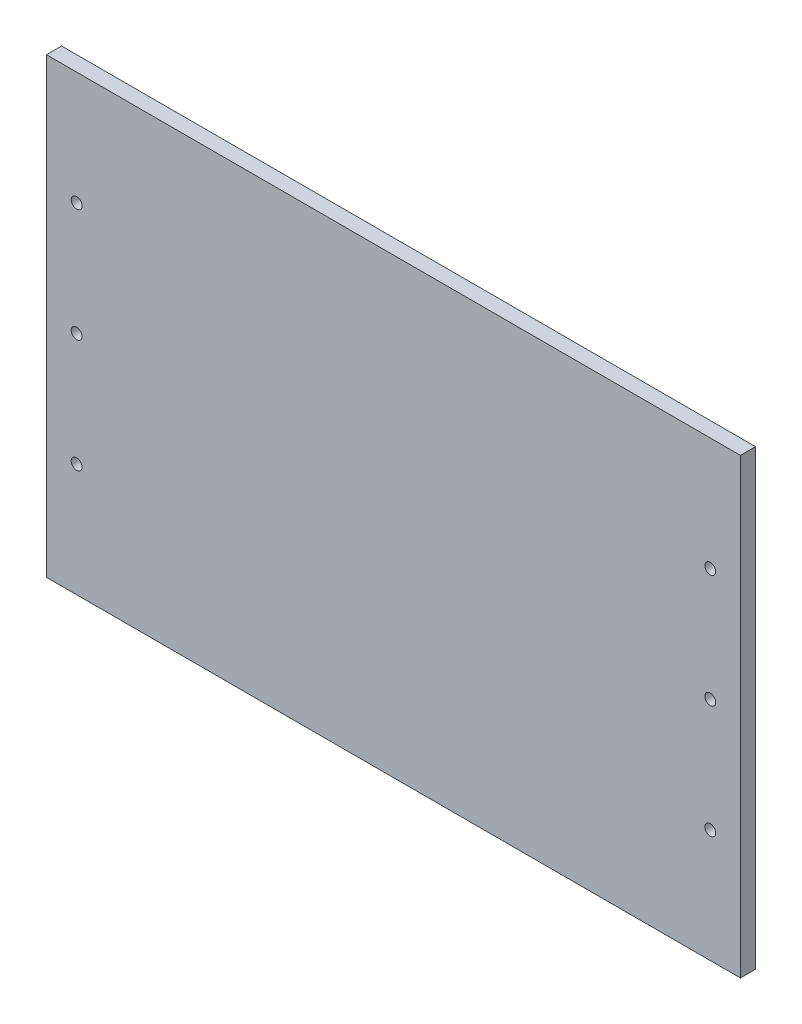
ISO-10303-21;
HEADER;
FILE_DESCRIPTION(('STEP AP214'),'2;1');
FILE_NAME('part.step','',(''),(''),'','','');
FILE_SCHEMA(('AUTOMOTIVE_DESIGN { 1 0 10303 214 1 1 1 1 }'));
ENDSEC;
DATA;
#1=APPLICATION_CONTEXT('core data for automotive mechanical design processes');
#2=APPLICATION_PROTOCOL_DEFINITION('international standard','automotive_design',2000,#1);
#3=PRODUCT_CONTEXT('',#1,'mechanical');
#4=PRODUCT('Part','Part','',(#3));
#5=PRODUCT_RELATED_PRODUCT_CATEGORY('part','',(#4));
#6=PRODUCT_DEFINITION_FORMATION('','',#4);
#7=PRODUCT_DEFINITION_CONTEXT('part definition',#1,'design');
#8=PRODUCT_DEFINITION('design','',#6,#7);
#9=PRODUCT_DEFINITION_SHAPE('','',#8);
#10=(LENGTH_UNIT() NAMED_UNIT(*) SI_UNIT(.MILLI.,.METRE.));
#11=(NAMED_UNIT(*) PLANE_ANGLE_UNIT() SI_UNIT($,.RADIAN.));
#12=(NAMED_UNIT(*) SI_UNIT($,.STERADIAN.) SOLID_ANGLE_UNIT());
#13=UNCERTAINTY_MEASURE_WITH_UNIT(LENGTH_MEASURE(1.E-05),#10,'distance_accuracy_value','');
#14=(GEOMETRIC_REPRESENTATION_CONTEXT(3) GLOBAL_UNCERTAINTY_ASSIGNED_CONTEXT((#13)) GLOBAL_UNIT_ASSIGNED_CONTEXT((#10,
#11,#12)) REPRESENTATION_CONTEXT('',''));
#15=CARTESIAN_POINT('',(0.,0.,0.));
#16=DIRECTION('',(0.,0.,1.));
#17=DIRECTION('',(1.,0.,0.));
#18=AXIS2_PLACEMENT_3D('',#15,#16,#17);
#19=CARTESIAN_POINT('',(115.,-75.,5.));
#20=DIRECTION('',(-1.,0.,0.));
#21=DIRECTION('',(0.,0.,1.));
#22=AXIS2_PLACEMENT_3D('',#19,#20,#21);
#23=PLANE('',#22);
#24=DIRECTION('',(0.,1.,0.));
#25=VECTOR('',#24,1.);
#26=CARTESIAN_POINT('',(115.,-75.,0.));
#27=LINE('',#26,#25);
#28=CARTESIAN_POINT('',(115.,-75.,0.));
#29=VERTEX_POINT('',#28);
#30=CARTESIAN_POINT('',(115.,75.,0.));
#31=VERTEX_POINT('',#30);
#32=EDGE_CURVE('E107',#29,#31,#27,.T.);
#33=ORIENTED_EDGE('',*,*,#32,.T.);
#34=DIRECTION('',(0.,0.,-1.));
#35=VECTOR('',#34,1.);
#36=CARTESIAN_POINT('',(115.,75.,5.));
#37=LINE('',#36,#35);
#38=CARTESIAN_POINT('',(115.,75.,5.));
#39=VERTEX_POINT('',#38);
#40=EDGE_CURVE('E11',#39,#31,#37,.T.);
#41=ORIENTED_EDGE('',*,*,#40,.F.);
#42=DIRECTION('',(0.,1.,0.));
#43=VECTOR('',#42,1.);
#44=CARTESIAN_POINT('',(115.,-75.,5.));
#45=LINE('',#44,#43);
#46=CARTESIAN_POINT('',(115.,-75.,5.));
#47=VERTEX_POINT('',#46);
#48=EDGE_CURVE('E94',#47,#39,#45,.T.);
#49=ORIENTED_EDGE('',*,*,#48,.F.);
#50=DIRECTION('',(0.,0.,-1.));
#51=VECTOR('',#50,1.);
#52=CARTESIAN_POINT('',(115.,-75.,5.));
#53=LINE('',#52,#51);
#54=EDGE_CURVE('E103',#47,#29,#53,.T.);
#55=ORIENTED_EDGE('',*,*,#54,.T.);
#56=EDGE_LOOP('',(#33,#41,#49,#55));
#57=FACE_BOUND('',#56,.T.);
#58=ADVANCED_FACE('F41',(#57),#23,.F.);
#59=CARTESIAN_POINT('',(-115.,74.9999999999999,5.));
#60=DIRECTION('',(0.,-1.,0.));
#61=DIRECTION('',(1.,0.,0.));
#62=AXIS2_PLACEMENT_3D('',#59,#60,#61);
#63=PLANE('',#62);
#64=DIRECTION('',(-1.,0.,0.));
#65=VECTOR('',#64,1.);
#66=CARTESIAN_POINT('',(-115.,74.9999999999999,0.));
#67=LINE('',#66,#65);
#68=CARTESIAN_POINT('',(-115.,74.9999999999999,0.));
#69=VERTEX_POINT('',#68);
#70=EDGE_CURVE('E98',#31,#69,#67,.T.);
#71=ORIENTED_EDGE('',*,*,#70,.T.);
#72=DIRECTION('',(0.,0.,-1.));
#73=VECTOR('',#72,1.);
#74=CARTESIAN_POINT('',(-115.,74.9999999999999,5.));
#75=LINE('',#74,#73);
#76=CARTESIAN_POINT('',(-115.,74.9999999999999,5.));
#77=VERTEX_POINT('',#76);
#78=EDGE_CURVE('E50',#77,#69,#75,.T.);
#79=ORIENTED_EDGE('',*,*,#78,.F.);
#80=DIRECTION('',(-1.,0.,0.));
#81=VECTOR('',#80,1.);
#82=CARTESIAN_POINT('',(-115.,74.9999999999999,5.));
#83=LINE('',#82,#81);
#84=EDGE_CURVE('E89',#39,#77,#83,.T.);
#85=ORIENTED_EDGE('',*,*,#84,.F.);
#86=ORIENTED_EDGE('',*,*,#40,.T.);
#87=EDGE_LOOP('',(#71,#79,#85,#86));
#88=FACE_BOUND('',#87,.T.);
#89=ADVANCED_FACE('F97',(#88),#63,.F.);
#90=CARTESIAN_POINT('',(-115.,-75.,5.));
#91=DIRECTION('',(1.,0.,0.));
#92=DIRECTION('',(0.,1.,0.));
#93=AXIS2_PLACEMENT_3D('',#90,#91,#92);
#94=PLANE('',#93);
#95=DIRECTION('',(0.,-1.,0.));
#96=VECTOR('',#95,1.);
#97=CARTESIAN_POINT('',(-115.,-75.,0.));
#98=LINE('',#97,#96);
#99=CARTESIAN_POINT('',(-115.,-75.,0.));
#100=VERTEX_POINT('',#99);
#101=EDGE_CURVE('E76',#69,#100,#98,.T.);
#102=ORIENTED_EDGE('',*,*,#101,.T.);
#103=DIRECTION('',(0.,0.,-1.));
#104=VECTOR('',#103,1.);
#105=CARTESIAN_POINT('',(-115.,-75.,5.));
#106=LINE('',#105,#104);
#107=CARTESIAN_POINT('',(-115.,-75.,5.));
#108=VERTEX_POINT('',#107);
#109=EDGE_CURVE('E99',#108,#100,#106,.T.);
#110=ORIENTED_EDGE('',*,*,#109,.F.);
#111=DIRECTION('',(0.,-1.,0.));
#112=VECTOR('',#111,1.);
#113=CARTESIAN_POINT('',(-115.,-75.,5.));
#114=LINE('',#113,#112);
#115=EDGE_CURVE('E92',#77,#108,#114,.T.);
#116=ORIENTED_EDGE('',*,*,#115,.F.);
#117=ORIENTED_EDGE('',*,*,#78,.T.);
#118=EDGE_LOOP('',(#102,#110,#116,#117));
#119=FACE_BOUND('',#118,.T.);
#120=ADVANCED_FACE('F101',(#119),#94,.F.);
#121=CARTESIAN_POINT('',(-115.,-75.,5.));
#122=DIRECTION('',(0.,1.,0.));
#123=DIRECTION('',(-1.,0.,0.));
#124=AXIS2_PLACEMENT_3D('',#121,#122,#123);
#125=PLANE('',#124);
#126=DIRECTION('',(1.,0.,0.));
#127=VECTOR('',#126,1.);
#128=CARTESIAN_POINT('',(-115.,-75.,0.));
#129=LINE('',#128,#127);
#130=EDGE_CURVE('E82',#100,#29,#129,.T.);
#131=ORIENTED_EDGE('',*,*,#130,.T.);
#132=ORIENTED_EDGE('',*,*,#54,.F.);
#133=DIRECTION('',(1.,0.,0.));
#134=VECTOR('',#133,1.);
#135=CARTESIAN_POINT('',(-115.,-75.,5.));
#136=LINE('',#135,#134);
#137=EDGE_CURVE('E59',#108,#47,#136,.T.);
#138=ORIENTED_EDGE('',*,*,#137,.F.);
#139=ORIENTED_EDGE('',*,*,#109,.T.);
#140=EDGE_LOOP('',(#131,#132,#138,#139));
#141=FACE_BOUND('',#140,.T.);
#142=ADVANCED_FACE('F201',(#141),#125,.F.);
#143=CARTESIAN_POINT('',(0.,0.,5.));
#144=DIRECTION('',(0.,0.,-1.));
#145=DIRECTION('',(-1.,0.,0.));
#146=AXIS2_PLACEMENT_3D('',#143,#144,#145);
#147=PLANE('',#146);
#148=CARTESIAN_POINT('',(-105.,37.5,5.));
#149=DIRECTION('',(0.,0.,-1.));
#150=DIRECTION('',(-1.,0.,0.));
#151=AXIS2_PLACEMENT_3D('',#148,#149,#150);
#152=CIRCLE('',#151,1.8);
#153=CARTESIAN_POINT('',(-106.8,37.5,5.));
#154=VERTEX_POINT('',#153);
#155=EDGE_CURVE('E44',#154,#154,#152,.T.);
#156=ORIENTED_EDGE('',*,*,#155,.T.);
#157=EDGE_LOOP('',(#156));
#158=FACE_BOUND('',#157,.T.);
#159=CARTESIAN_POINT('',(-105.,0.,5.));
#160=DIRECTION('',(0.,0.,-1.));
#161=DIRECTION('',(-1.,0.,0.));
#162=AXIS2_PLACEMENT_3D('',#159,#160,#161);
#163=CIRCLE('',#162,1.8);
#164=CARTESIAN_POINT('',(-106.8,0.,5.));
#165=VERTEX_POINT('',#164);
#166=EDGE_CURVE('E133',#165,#165,#163,.T.);
#167=ORIENTED_EDGE('',*,*,#166,.T.);
#168=EDGE_LOOP('',(#167));
#169=FACE_BOUND('',#168,.T.);
#170=CARTESIAN_POINT('',(-105.,-37.5,5.));
#171=DIRECTION('',(0.,0.,-1.));
#172=DIRECTION('',(-1.,0.,0.));
#173=AXIS2_PLACEMENT_3D('',#170,#171,#172);
#174=CIRCLE('',#173,1.8);
#175=CARTESIAN_POINT('',(-106.8,-37.5,5.));
#176=VERTEX_POINT('',#175);
#177=EDGE_CURVE('E129',#176,#176,#174,.T.);
#178=ORIENTED_EDGE('',*,*,#177,.T.);
#179=EDGE_LOOP('',(#178));
#180=FACE_BOUND('',#179,.T.);
#181=CARTESIAN_POINT('',(105.,-37.5,5.));
#182=DIRECTION('',(0.,0.,-1.));
#183=DIRECTION('',(-1.,0.,0.));
#184=AXIS2_PLACEMENT_3D('',#181,#182,#183);
#185=CIRCLE('',#184,1.8);
#186=CARTESIAN_POINT('',(103.2,-37.5,5.));
#187=VERTEX_POINT('',#186);
#188=EDGE_CURVE('E124',#187,#187,#185,.T.);
#189=ORIENTED_EDGE('',*,*,#188,.T.);
#190=EDGE_LOOP('',(#189));
#191=FACE_BOUND('',#190,.T.);
#192=CARTESIAN_POINT('',(105.,0.,5.));
#193=DIRECTION('',(0.,0.,-1.));
#194=DIRECTION('',(-1.,0.,0.));
#195=AXIS2_PLACEMENT_3D('',#192,#193,#194);
#196=CIRCLE('',#195,1.8);
#197=CARTESIAN_POINT('',(103.2,0.,5.));
#198=VERTEX_POINT('',#197);
#199=EDGE_CURVE('E119',#198,#198,#196,.T.);
#200=ORIENTED_EDGE('',*,*,#199,.T.);
#201=EDGE_LOOP('',(#200));
#202=FACE_BOUND('',#201,.T.);
#203=CARTESIAN_POINT('',(105.,37.5,5.));
#204=DIRECTION('',(0.,0.,-1.));
#205=DIRECTION('',(-1.,0.,0.));
#206=AXIS2_PLACEMENT_3D('',#203,#204,#205);
#207=CIRCLE('',#206,1.8);
#208=CARTESIAN_POINT('',(103.2,37.5,5.));
#209=VERTEX_POINT('',#208);
#210=EDGE_CURVE('E110',#209,#209,#207,.T.);
#211=ORIENTED_EDGE('',*,*,#210,.T.);
#212=EDGE_LOOP('',(#211));
#213=FACE_BOUND('',#212,.T.);
#214=ORIENTED_EDGE('',*,*,#48,.T.);
#215=ORIENTED_EDGE('',*,*,#84,.T.);
#216=ORIENTED_EDGE('',*,*,#115,.T.);
#217=ORIENTED_EDGE('',*,*,#137,.T.);
#218=EDGE_LOOP('',(#214,#215,#216,#217));
#219=FACE_BOUND('',#218,.T.);
#220=ADVANCED_FACE('F90',(#158,#169,#180,#191,#202,#213,#219),#147,.F.);
#221=CARTESIAN_POINT('',(0.,0.,0.));
#222=DIRECTION('',(0.,0.,-1.));
#223=DIRECTION('',(-1.,0.,0.));
#224=AXIS2_PLACEMENT_3D('',#221,#222,#223);
#225=PLANE('',#224);
#226=CARTESIAN_POINT('',(-105.,37.5,0.));
#227=DIRECTION('',(0.,0.,-1.));
#228=DIRECTION('',(-1.,0.,0.));
#229=AXIS2_PLACEMENT_3D('',#226,#227,#228);
#230=CIRCLE('',#229,3.5);
#231=CARTESIAN_POINT('',(-108.5,37.5,0.));
#232=VERTEX_POINT('',#231);
#233=EDGE_CURVE('E416',#232,#232,#230,.T.);
#234=ORIENTED_EDGE('',*,*,#233,.F.);
#235=EDGE_LOOP('',(#234));
#236=FACE_BOUND('',#235,.T.);
#237=CARTESIAN_POINT('',(-105.,0.,0.));
#238=DIRECTION('',(0.,0.,-1.));
#239=DIRECTION('',(-1.,0.,0.));
#240=AXIS2_PLACEMENT_3D('',#237,#238,#239);
#241=CIRCLE('',#240,3.5);
#242=CARTESIAN_POINT('',(-108.5,0.,0.));
#243=VERTEX_POINT('',#242);
#244=EDGE_CURVE('E148',#243,#243,#241,.T.);
#245=ORIENTED_EDGE('',*,*,#244,.F.);
#246=EDGE_LOOP('',(#245));
#247=FACE_BOUND('',#246,.T.);
#248=CARTESIAN_POINT('',(-105.,-37.5,0.));
#249=DIRECTION('',(0.,0.,-1.));
#250=DIRECTION('',(-1.,0.,0.));
#251=AXIS2_PLACEMENT_3D('',#248,#249,#250);
#252=CIRCLE('',#251,3.5);
#253=CARTESIAN_POINT('',(-108.5,-37.5,0.));
#254=VERTEX_POINT('',#253);
#255=EDGE_CURVE('E135',#254,#254,#252,.T.);
#256=ORIENTED_EDGE('',*,*,#255,.F.);
#257=EDGE_LOOP('',(#256));
#258=FACE_BOUND('',#257,.T.);
#259=CARTESIAN_POINT('',(105.,-37.5,0.));
#260=DIRECTION('',(0.,0.,-1.));
#261=DIRECTION('',(-1.,0.,0.));
#262=AXIS2_PLACEMENT_3D('',#259,#260,#261);
#263=CIRCLE('',#262,3.5);
#264=CARTESIAN_POINT('',(101.5,-37.5,0.));
#265=VERTEX_POINT('',#264);
#266=EDGE_CURVE('E131',#265,#265,#263,.T.);
#267=ORIENTED_EDGE('',*,*,#266,.F.);
#268=EDGE_LOOP('',(#267));
#269=FACE_BOUND('',#268,.T.);
#270=CARTESIAN_POINT('',(105.,0.,0.));
#271=DIRECTION('',(0.,0.,-1.));
#272=DIRECTION('',(-1.,0.,0.));
#273=AXIS2_PLACEMENT_3D('',#270,#271,#272);
#274=CIRCLE('',#273,3.5);
#275=CARTESIAN_POINT('',(101.5,0.,0.));
#276=VERTEX_POINT('',#275);
#277=EDGE_CURVE('E127',#276,#276,#274,.T.);
#278=ORIENTED_EDGE('',*,*,#277,.F.);
#279=EDGE_LOOP('',(#278));
#280=FACE_BOUND('',#279,.T.);
#281=CARTESIAN_POINT('',(105.,37.5,0.));
#282=DIRECTION('',(0.,0.,-1.));
#283=DIRECTION('',(-1.,0.,0.));
#284=AXIS2_PLACEMENT_3D('',#281,#282,#283);
#285=CIRCLE('',#284,3.5);
#286=CARTESIAN_POINT('',(101.5,37.5,0.));
#287=VERTEX_POINT('',#286);
#288=EDGE_CURVE('E122',#287,#287,#285,.T.);
#289=ORIENTED_EDGE('',*,*,#288,.F.);
#290=EDGE_LOOP('',(#289));
#291=FACE_BOUND('',#290,.T.);
#292=ORIENTED_EDGE('',*,*,#32,.F.);
#293=ORIENTED_EDGE('',*,*,#130,.F.);
#294=ORIENTED_EDGE('',*,*,#101,.F.);
#295=ORIENTED_EDGE('',*,*,#70,.F.);
#296=EDGE_LOOP('',(#292,#293,#294,#295));
#297=FACE_BOUND('',#296,.T.);
#298=ADVANCED_FACE('F194',(#236,#247,#258,#269,#280,#291,#297),#225,.T.);
#299=CARTESIAN_POINT('',(105.,37.5,0.));
#300=DIRECTION('',(0.,0.,-1.));
#301=DIRECTION('',(-1.,0.,0.));
#302=AXIS2_PLACEMENT_3D('',#299,#300,#301);
#303=CYLINDRICAL_SURFACE('',#302,1.8);
#304=CARTESIAN_POINT('',(105.,37.5,2.4));
#305=DIRECTION('',(0.,0.,-1.));
#306=DIRECTION('',(-1.,0.,0.));
#307=AXIS2_PLACEMENT_3D('',#304,#305,#306);
#308=CIRCLE('',#307,1.8);
#309=CARTESIAN_POINT('',(103.2,37.5,2.4));
#310=VERTEX_POINT('',#309);
#311=EDGE_CURVE('E118',#310,#310,#308,.T.);
#312=ORIENTED_EDGE('',*,*,#311,.T.);
#313=EDGE_LOOP('',(#312));
#314=FACE_BOUND('',#313,.T.);
#315=ORIENTED_EDGE('',*,*,#210,.F.);
#316=EDGE_LOOP('',(#315));
#317=FACE_BOUND('',#316,.T.);
#318=ADVANCED_FACE('F178',(#314,#317),#303,.F.);
#319=CARTESIAN_POINT('',(106.8,37.5,2.4));
#320=DIRECTION('',(0.,0.,1.));
#321=DIRECTION('',(1.,0.,0.));
#322=AXIS2_PLACEMENT_3D('',#319,#320,#321);
#323=PLANE('',#322);
#324=ORIENTED_EDGE('',*,*,#311,.F.);
#325=EDGE_LOOP('',(#324));
#326=FACE_BOUND('',#325,.T.);
#327=CARTESIAN_POINT('',(105.,37.5,2.4));
#328=DIRECTION('',(0.,0.,-1.));
#329=DIRECTION('',(-1.,0.,0.));
#330=AXIS2_PLACEMENT_3D('',#327,#328,#329);
#331=CIRCLE('',#330,3.5);
#332=CARTESIAN_POINT('',(101.5,37.5,2.4));
#333=VERTEX_POINT('',#332);
#334=EDGE_CURVE('E172',#333,#333,#331,.T.);
#335=ORIENTED_EDGE('',*,*,#334,.T.);
#336=EDGE_LOOP('',(#335));
#337=FACE_BOUND('',#336,.T.);
#338=ADVANCED_FACE('F181',(#326,#337),#323,.F.);
#339=CARTESIAN_POINT('',(105.,37.5,0.));
#340=DIRECTION('',(0.,0.,-1.));
#341=DIRECTION('',(-1.,0.,0.));
#342=AXIS2_PLACEMENT_3D('',#339,#340,#341);
#343=CYLINDRICAL_SURFACE('',#342,3.5);
#344=ORIENTED_EDGE('',*,*,#334,.F.);
#345=EDGE_LOOP('',(#344));
#346=FACE_BOUND('',#345,.T.);
#347=ORIENTED_EDGE('',*,*,#288,.T.);
#348=EDGE_LOOP('',(#347));
#349=FACE_BOUND('',#348,.T.);
#350=ADVANCED_FACE('F184',(#346,#349),#343,.F.);
#351=CARTESIAN_POINT('',(105.,0.,0.));
#352=DIRECTION('',(0.,0.,-1.));
#353=DIRECTION('',(-1.,0.,0.));
#354=AXIS2_PLACEMENT_3D('',#351,#352,#353);
#355=CYLINDRICAL_SURFACE('',#354,1.8);
#356=CARTESIAN_POINT('',(105.,0.,2.4));
#357=DIRECTION('',(0.,0.,-1.));
#358=DIRECTION('',(-1.,0.,0.));
#359=AXIS2_PLACEMENT_3D('',#356,#357,#358);
#360=CIRCLE('',#359,1.8);
#361=CARTESIAN_POINT('',(103.2,0.,2.4));
#362=VERTEX_POINT('',#361);
#363=EDGE_CURVE('E123',#362,#362,#360,.T.);
#364=ORIENTED_EDGE('',*,*,#363,.T.);
#365=EDGE_LOOP('',(#364));
#366=FACE_BOUND('',#365,.T.);
#367=ORIENTED_EDGE('',*,*,#199,.F.);
#368=EDGE_LOOP('',(#367));
#369=FACE_BOUND('',#368,.T.);
#370=ADVANCED_FACE('F190',(#366,#369),#355,.F.);
#371=CARTESIAN_POINT('',(106.8,0.,2.4));
#372=DIRECTION('',(0.,0.,1.));
#373=DIRECTION('',(1.,0.,0.));
#374=AXIS2_PLACEMENT_3D('',#371,#372,#373);
#375=PLANE('',#374);
#376=ORIENTED_EDGE('',*,*,#363,.F.);
#377=EDGE_LOOP('',(#376));
#378=FACE_BOUND('',#377,.T.);
#379=CARTESIAN_POINT('',(105.,0.,2.4));
#380=DIRECTION('',(0.,0.,-1.));
#381=DIRECTION('',(-1.,0.,0.));
#382=AXIS2_PLACEMENT_3D('',#379,#380,#381);
#383=CIRCLE('',#382,3.5);
#384=CARTESIAN_POINT('',(101.5,0.,2.4));
#385=VERTEX_POINT('',#384);
#386=EDGE_CURVE('E165',#385,#385,#383,.T.);
#387=ORIENTED_EDGE('',*,*,#386,.T.);
#388=EDGE_LOOP('',(#387));
#389=FACE_BOUND('',#388,.T.);
#390=ADVANCED_FACE('F268',(#378,#389),#375,.F.);
#391=CARTESIAN_POINT('',(105.,0.,0.));
#392=DIRECTION('',(0.,0.,-1.));
#393=DIRECTION('',(-1.,0.,0.));
#394=AXIS2_PLACEMENT_3D('',#391,#392,#393);
#395=CYLINDRICAL_SURFACE('',#394,3.5);
#396=ORIENTED_EDGE('',*,*,#386,.F.);
#397=EDGE_LOOP('',(#396));
#398=FACE_BOUND('',#397,.T.);
#399=ORIENTED_EDGE('',*,*,#277,.T.);
#400=EDGE_LOOP('',(#399));
#401=FACE_BOUND('',#400,.T.);
#402=ADVANCED_FACE('F278',(#398,#401),#395,.F.);
#403=CARTESIAN_POINT('',(105.,-37.5,0.));
#404=DIRECTION('',(0.,0.,-1.));
#405=DIRECTION('',(-1.,0.,0.));
#406=AXIS2_PLACEMENT_3D('',#403,#404,#405);
#407=CYLINDRICAL_SURFACE('',#406,1.8);
#408=CARTESIAN_POINT('',(105.,-37.5,2.4));
#409=DIRECTION('',(0.,0.,-1.));
#410=DIRECTION('',(-1.,0.,0.));
#411=AXIS2_PLACEMENT_3D('',#408,#409,#410);
#412=CIRCLE('',#411,1.8);
#413=CARTESIAN_POINT('',(103.2,-37.5,2.4));
#414=VERTEX_POINT('',#413);
#415=EDGE_CURVE('E128',#414,#414,#412,.T.);
#416=ORIENTED_EDGE('',*,*,#415,.T.);
#417=EDGE_LOOP('',(#416));
#418=FACE_BOUND('',#417,.T.);
#419=ORIENTED_EDGE('',*,*,#188,.F.);
#420=EDGE_LOOP('',(#419));
#421=FACE_BOUND('',#420,.T.);
#422=ADVANCED_FACE('F288',(#418,#421),#407,.F.);
#423=CARTESIAN_POINT('',(106.8,-37.5,2.4));
#424=DIRECTION('',(0.,0.,1.));
#425=DIRECTION('',(1.,0.,0.));
#426=AXIS2_PLACEMENT_3D('',#423,#424,#425);
#427=PLANE('',#426);
#428=ORIENTED_EDGE('',*,*,#415,.F.);
#429=EDGE_LOOP('',(#428));
#430=FACE_BOUND('',#429,.T.);
#431=CARTESIAN_POINT('',(105.,-37.5,2.4));
#432=DIRECTION('',(0.,0.,-1.));
#433=DIRECTION('',(-1.,0.,0.));
#434=AXIS2_PLACEMENT_3D('',#431,#432,#433);
#435=CIRCLE('',#434,3.5);
#436=CARTESIAN_POINT('',(101.5,-37.5,2.4));
#437=VERTEX_POINT('',#436);
#438=EDGE_CURVE('E158',#437,#437,#435,.T.);
#439=ORIENTED_EDGE('',*,*,#438,.T.);
#440=EDGE_LOOP('',(#439));
#441=FACE_BOUND('',#440,.T.);
#442=ADVANCED_FACE('F298',(#430,#441),#427,.F.);
#443=CARTESIAN_POINT('',(105.,-37.5,0.));
#444=DIRECTION('',(0.,0.,-1.));
#445=DIRECTION('',(-1.,0.,0.));
#446=AXIS2_PLACEMENT_3D('',#443,#444,#445);
#447=CYLINDRICAL_SURFACE('',#446,3.5);
#448=ORIENTED_EDGE('',*,*,#438,.F.);
#449=EDGE_LOOP('',(#448));
#450=FACE_BOUND('',#449,.T.);
#451=ORIENTED_EDGE('',*,*,#266,.T.);
#452=EDGE_LOOP('',(#451));
#453=FACE_BOUND('',#452,.T.);
#454=ADVANCED_FACE('F308',(#450,#453),#447,.F.);
#455=CARTESIAN_POINT('',(-105.,-37.5,0.));
#456=DIRECTION('',(0.,0.,-1.));
#457=DIRECTION('',(-1.,0.,0.));
#458=AXIS2_PLACEMENT_3D('',#455,#456,#457);
#459=CYLINDRICAL_SURFACE('',#458,1.8);
#460=CARTESIAN_POINT('',(-105.,-37.5,2.4));
#461=DIRECTION('',(0.,0.,-1.));
#462=DIRECTION('',(-1.,0.,0.));
#463=AXIS2_PLACEMENT_3D('',#460,#461,#462);
#464=CIRCLE('',#463,1.8);
#465=CARTESIAN_POINT('',(-106.8,-37.5,2.4));
#466=VERTEX_POINT('',#465);
#467=EDGE_CURVE('E132',#466,#466,#464,.T.);
#468=ORIENTED_EDGE('',*,*,#467,.T.);
#469=EDGE_LOOP('',(#468));
#470=FACE_BOUND('',#469,.T.);
#471=ORIENTED_EDGE('',*,*,#177,.F.);
#472=EDGE_LOOP('',(#471));
#473=FACE_BOUND('',#472,.T.);
#474=ADVANCED_FACE('F318',(#470,#473),#459,.F.);
#475=CARTESIAN_POINT('',(-103.2,-37.5,2.4));
#476=DIRECTION('',(0.,0.,1.));
#477=DIRECTION('',(1.,0.,0.));
#478=AXIS2_PLACEMENT_3D('',#475,#476,#477);
#479=PLANE('',#478);
#480=ORIENTED_EDGE('',*,*,#467,.F.);
#481=EDGE_LOOP('',(#480));
#482=FACE_BOUND('',#481,.T.);
#483=CARTESIAN_POINT('',(-105.,-37.5,2.4));
#484=DIRECTION('',(0.,0.,-1.));
#485=DIRECTION('',(-1.,0.,0.));
#486=AXIS2_PLACEMENT_3D('',#483,#484,#485);
#487=CIRCLE('',#486,3.5);
#488=CARTESIAN_POINT('',(-108.5,-37.5,2.4));
#489=VERTEX_POINT('',#488);
#490=EDGE_CURVE('E140',#489,#489,#487,.T.);
#491=ORIENTED_EDGE('',*,*,#490,.T.);
#492=EDGE_LOOP('',(#491));
#493=FACE_BOUND('',#492,.T.);
#494=ADVANCED_FACE('F328',(#482,#493),#479,.F.);
#495=CARTESIAN_POINT('',(-105.,-37.5,0.));
#496=DIRECTION('',(0.,0.,-1.));
#497=DIRECTION('',(-1.,0.,0.));
#498=AXIS2_PLACEMENT_3D('',#495,#496,#497);
#499=CYLINDRICAL_SURFACE('',#498,3.5);
#500=ORIENTED_EDGE('',*,*,#490,.F.);
#501=EDGE_LOOP('',(#500));
#502=FACE_BOUND('',#501,.T.);
#503=ORIENTED_EDGE('',*,*,#255,.T.);
#504=EDGE_LOOP('',(#503));
#505=FACE_BOUND('',#504,.T.);
#506=ADVANCED_FACE('F338',(#502,#505),#499,.F.);
#507=CARTESIAN_POINT('',(-105.,0.,0.));
#508=DIRECTION('',(0.,0.,-1.));
#509=DIRECTION('',(-1.,0.,0.));
#510=AXIS2_PLACEMENT_3D('',#507,#508,#509);
#511=CYLINDRICAL_SURFACE('',#510,1.8);
#512=CARTESIAN_POINT('',(-105.,0.,2.4));
#513=DIRECTION('',(0.,0.,-1.));
#514=DIRECTION('',(-1.,0.,0.));
#515=AXIS2_PLACEMENT_3D('',#512,#513,#514);
#516=CIRCLE('',#515,1.8);
#517=CARTESIAN_POINT('',(-106.8,0.,2.4));
#518=VERTEX_POINT('',#517);
#519=EDGE_CURVE('E136',#518,#518,#516,.T.);
#520=ORIENTED_EDGE('',*,*,#519,.T.);
#521=EDGE_LOOP('',(#520));
#522=FACE_BOUND('',#521,.T.);
#523=ORIENTED_EDGE('',*,*,#166,.F.);
#524=EDGE_LOOP('',(#523));
#525=FACE_BOUND('',#524,.T.);
#526=ADVANCED_FACE('F348',(#522,#525),#511,.F.);
#527=CARTESIAN_POINT('',(-103.2,0.,2.4));
#528=DIRECTION('',(0.,0.,1.));
#529=DIRECTION('',(1.,0.,0.));
#530=AXIS2_PLACEMENT_3D('',#527,#528,#529);
#531=PLANE('',#530);
#532=ORIENTED_EDGE('',*,*,#519,.F.);
#533=EDGE_LOOP('',(#532));
#534=FACE_BOUND('',#533,.T.);
#535=CARTESIAN_POINT('',(-105.,0.,2.4));
#536=DIRECTION('',(0.,0.,-1.));
#537=DIRECTION('',(-1.,0.,0.));
#538=AXIS2_PLACEMENT_3D('',#535,#536,#537);
#539=CIRCLE('',#538,3.5);
#540=CARTESIAN_POINT('',(-108.5,0.,2.4));
#541=VERTEX_POINT('',#540);
#542=EDGE_CURVE('E143',#541,#541,#539,.T.);
#543=ORIENTED_EDGE('',*,*,#542,.T.);
#544=EDGE_LOOP('',(#543));
#545=FACE_BOUND('',#544,.T.);
#546=ADVANCED_FACE('F358',(#534,#545),#531,.F.);
#547=CARTESIAN_POINT('',(-105.,0.,0.));
#548=DIRECTION('',(0.,0.,-1.));
#549=DIRECTION('',(-1.,0.,0.));
#550=AXIS2_PLACEMENT_3D('',#547,#548,#549);
#551=CYLINDRICAL_SURFACE('',#550,3.5);
#552=ORIENTED_EDGE('',*,*,#542,.F.);
#553=EDGE_LOOP('',(#552));
#554=FACE_BOUND('',#553,.T.);
#555=ORIENTED_EDGE('',*,*,#244,.T.);
#556=EDGE_LOOP('',(#555));
#557=FACE_BOUND('',#556,.T.);
#558=ADVANCED_FACE('F367',(#554,#557),#551,.F.);
#559=CARTESIAN_POINT('',(-105.,37.5,0.));
#560=DIRECTION('',(0.,0.,-1.));
#561=DIRECTION('',(-1.,0.,0.));
#562=AXIS2_PLACEMENT_3D('',#559,#560,#561);
#563=CYLINDRICAL_SURFACE('',#562,1.8);
#564=CARTESIAN_POINT('',(-105.,37.5,2.4));
#565=DIRECTION('',(0.,0.,-1.));
#566=DIRECTION('',(-1.,0.,0.));
#567=AXIS2_PLACEMENT_3D('',#564,#565,#566);
#568=CIRCLE('',#567,1.8);
#569=CARTESIAN_POINT('',(-106.8,37.5,2.4));
#570=VERTEX_POINT('',#569);
#571=EDGE_CURVE('E418',#570,#570,#568,.T.);
#572=ORIENTED_EDGE('',*,*,#571,.T.);
#573=EDGE_LOOP('',(#572));
#574=FACE_BOUND('',#573,.T.);
#575=ORIENTED_EDGE('',*,*,#155,.F.);
#576=EDGE_LOOP('',(#575));
#577=FACE_BOUND('',#576,.T.);
#578=ADVANCED_FACE('F377',(#574,#577),#563,.F.);
#579=CARTESIAN_POINT('',(-103.2,37.5,2.4));
#580=DIRECTION('',(0.,0.,1.));
#581=DIRECTION('',(1.,0.,0.));
#582=AXIS2_PLACEMENT_3D('',#579,#580,#581);
#583=PLANE('',#582);
#584=ORIENTED_EDGE('',*,*,#571,.F.);
#585=EDGE_LOOP('',(#584));
#586=FACE_BOUND('',#585,.T.);
#587=CARTESIAN_POINT('',(-105.,37.5,2.4));
#588=DIRECTION('',(0.,0.,-1.));
#589=DIRECTION('',(-1.,0.,0.));
#590=AXIS2_PLACEMENT_3D('',#587,#588,#589);
#591=CIRCLE('',#590,3.5);
#592=CARTESIAN_POINT('',(-108.5,37.5,2.4));
#593=VERTEX_POINT('',#592);
#594=EDGE_CURVE('E413',#593,#593,#591,.T.);
#595=ORIENTED_EDGE('',*,*,#594,.T.);
#596=EDGE_LOOP('',(#595));
#597=FACE_BOUND('',#596,.T.);
#598=ADVANCED_FACE('F387',(#586,#597),#583,.F.);
#599=CARTESIAN_POINT('',(-105.,37.5,0.));
#600=DIRECTION('',(0.,0.,-1.));
#601=DIRECTION('',(-1.,0.,0.));
#602=AXIS2_PLACEMENT_3D('',#599,#600,#601);
#603=CYLINDRICAL_SURFACE('',#602,3.5);
#604=ORIENTED_EDGE('',*,*,#594,.F.);
#605=EDGE_LOOP('',(#604));
#606=FACE_BOUND('',#605,.T.);
#607=ORIENTED_EDGE('',*,*,#233,.T.);
#608=EDGE_LOOP('',(#607));
#609=FACE_BOUND('',#608,.T.);
#610=ADVANCED_FACE('F397',(#606,#609),#603,.F.);
#611=CLOSED_SHELL('',(#58,#89,#120,#142,#220,#298,#318,#338,#350,#370,#390,#402,#422,#442,#454,
#474,#494,#506,#526,#546,#558,#578,#598,#610));
#612=MANIFOLD_SOLID_BREP('B2',#611);
#613=ADVANCED_BREP_SHAPE_REPRESENTATION('',(#18,#612),#14);
#614=SHAPE_DEFINITION_REPRESENTATION(#9,#613);
ENDSEC;
END-ISO-10303-21;
